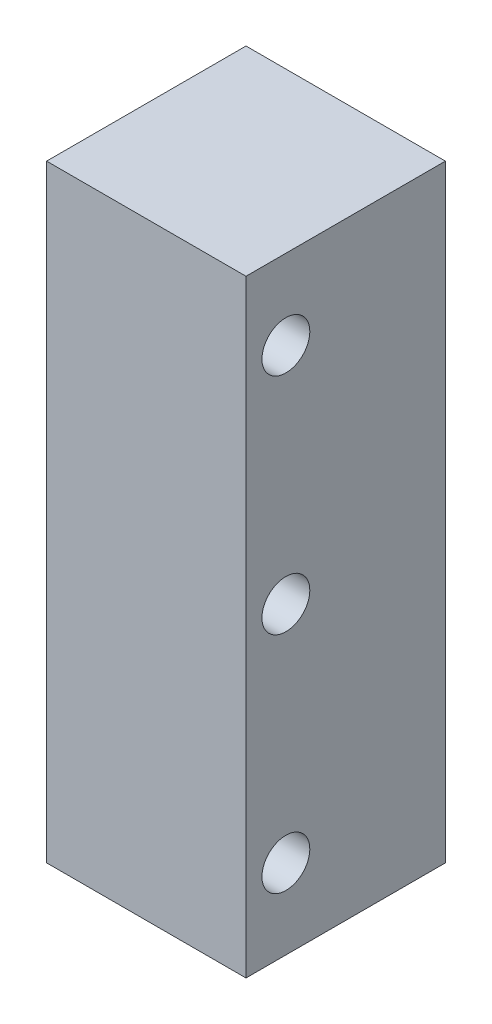
ISO-10303-21;
HEADER;
FILE_DESCRIPTION(('STEP AP214'),'2;1');
FILE_NAME('part.step','',(''),(''),'','','');
FILE_SCHEMA(('AUTOMOTIVE_DESIGN { 1 0 10303 214 1 1 1 1 }'));
ENDSEC;
DATA;
#1=APPLICATION_CONTEXT('core data for automotive mechanical design processes');
#2=APPLICATION_PROTOCOL_DEFINITION('international standard','automotive_design',2000,#1);
#3=PRODUCT_CONTEXT('',#1,'mechanical');
#4=PRODUCT('Part','Part','',(#3));
#5=PRODUCT_RELATED_PRODUCT_CATEGORY('part','',(#4));
#6=PRODUCT_DEFINITION_FORMATION('','',#4);
#7=PRODUCT_DEFINITION_CONTEXT('part definition',#1,'design');
#8=PRODUCT_DEFINITION('design','',#6,#7);
#9=PRODUCT_DEFINITION_SHAPE('','',#8);
#10=(LENGTH_UNIT() NAMED_UNIT(*) SI_UNIT(.MILLI.,.METRE.));
#11=(NAMED_UNIT(*) PLANE_ANGLE_UNIT() SI_UNIT($,.RADIAN.));
#12=(NAMED_UNIT(*) SI_UNIT($,.STERADIAN.) SOLID_ANGLE_UNIT());
#13=UNCERTAINTY_MEASURE_WITH_UNIT(LENGTH_MEASURE(1.E-05),#10,'distance_accuracy_value','');
#14=(GEOMETRIC_REPRESENTATION_CONTEXT(3) GLOBAL_UNCERTAINTY_ASSIGNED_CONTEXT((#13)) GLOBAL_UNIT_ASSIGNED_CONTEXT((#10,
#11,#12)) REPRESENTATION_CONTEXT('',''));
#15=CARTESIAN_POINT('',(0.,0.,0.));
#16=DIRECTION('',(0.,0.,1.));
#17=DIRECTION('',(1.,0.,0.));
#18=AXIS2_PLACEMENT_3D('',#15,#16,#17);
#19=CARTESIAN_POINT('',(25.,76.2,50.));
#20=DIRECTION('',(-1.,0.,0.));
#21=DIRECTION('',(0.,0.,1.));
#22=AXIS2_PLACEMENT_3D('',#19,#20,#21);
#23=PLANE('',#22);
#24=CARTESIAN_POINT('',(25.,56.2,40.));
#25=DIRECTION('',(1.,0.,0.));
#26=DIRECTION('',(0.,1.,0.));
#27=AXIS2_PLACEMENT_3D('',#24,#25,#26);
#28=CIRCLE('',#27,5.99999999999999);
#29=CARTESIAN_POINT('',(25.,62.2,40.));
#30=VERTEX_POINT('',#29);
#31=EDGE_CURVE('E124',#30,#30,#28,.T.);
#32=ORIENTED_EDGE('',*,*,#31,.F.);
#33=EDGE_LOOP('',(#32));
#34=FACE_BOUND('',#33,.T.);
#35=CARTESIAN_POINT('',(25.,0.,40.));
#36=DIRECTION('',(1.,0.,0.));
#37=DIRECTION('',(0.,1.,0.));
#38=AXIS2_PLACEMENT_3D('',#35,#36,#37);
#39=CIRCLE('',#38,5.99999999999999);
#40=CARTESIAN_POINT('',(25.,6.00000000000001,40.));
#41=VERTEX_POINT('',#40);
#42=EDGE_CURVE('E118',#41,#41,#39,.T.);
#43=ORIENTED_EDGE('',*,*,#42,.F.);
#44=EDGE_LOOP('',(#43));
#45=FACE_BOUND('',#44,.T.);
#46=CARTESIAN_POINT('',(25.,-56.2,40.));
#47=DIRECTION('',(1.,0.,0.));
#48=DIRECTION('',(0.,1.,0.));
#49=AXIS2_PLACEMENT_3D('',#46,#47,#48);
#50=CIRCLE('',#49,6.00000000000001);
#51=CARTESIAN_POINT('',(25.,-50.2,40.));
#52=VERTEX_POINT('',#51);
#53=EDGE_CURVE('E112',#52,#52,#50,.T.);
#54=ORIENTED_EDGE('',*,*,#53,.F.);
#55=EDGE_LOOP('',(#54));
#56=FACE_BOUND('',#55,.T.);
#57=DIRECTION('',(0.,1.,0.));
#58=VECTOR('',#57,1.);
#59=CARTESIAN_POINT('',(25.,76.2,0.));
#60=LINE('',#59,#58);
#61=CARTESIAN_POINT('',(25.,-76.2,0.));
#62=VERTEX_POINT('',#61);
#63=CARTESIAN_POINT('',(25.,76.2,0.));
#64=VERTEX_POINT('',#63);
#65=EDGE_CURVE('E98',#62,#64,#60,.T.);
#66=ORIENTED_EDGE('',*,*,#65,.T.);
#67=DIRECTION('',(0.,0.,-1.));
#68=VECTOR('',#67,1.);
#69=CARTESIAN_POINT('',(25.,76.2,50.));
#70=LINE('',#69,#68);
#71=CARTESIAN_POINT('',(25.,76.2,50.));
#72=VERTEX_POINT('',#71);
#73=EDGE_CURVE('E11',#72,#64,#70,.T.);
#74=ORIENTED_EDGE('',*,*,#73,.F.);
#75=DIRECTION('',(0.,1.,0.));
#76=VECTOR('',#75,1.);
#77=CARTESIAN_POINT('',(25.,76.2,50.));
#78=LINE('',#77,#76);
#79=CARTESIAN_POINT('',(25.,-76.2,50.));
#80=VERTEX_POINT('',#79);
#81=EDGE_CURVE('E86',#80,#72,#78,.T.);
#82=ORIENTED_EDGE('',*,*,#81,.F.);
#83=DIRECTION('',(0.,0.,-1.));
#84=VECTOR('',#83,1.);
#85=CARTESIAN_POINT('',(25.,-76.2,50.));
#86=LINE('',#85,#84);
#87=EDGE_CURVE('E94',#80,#62,#86,.T.);
#88=ORIENTED_EDGE('',*,*,#87,.T.);
#89=EDGE_LOOP('',(#66,#74,#82,#88));
#90=FACE_BOUND('',#89,.T.);
#91=ADVANCED_FACE('F35',(#34,#45,#56,#90),#23,.F.);
#92=CARTESIAN_POINT('',(-25.,76.2,50.));
#93=DIRECTION('',(0.,-1.,0.));
#94=DIRECTION('',(0.,0.,-1.));
#95=AXIS2_PLACEMENT_3D('',#92,#93,#94);
#96=PLANE('',#95);
#97=DIRECTION('',(-1.,0.,0.));
#98=VECTOR('',#97,1.);
#99=CARTESIAN_POINT('',(-25.,76.2,0.));
#100=LINE('',#99,#98);
#101=CARTESIAN_POINT('',(-25.,76.2,0.));
#102=VERTEX_POINT('',#101);
#103=EDGE_CURVE('E90',#64,#102,#100,.T.);
#104=ORIENTED_EDGE('',*,*,#103,.T.);
#105=DIRECTION('',(0.,0.,-1.));
#106=VECTOR('',#105,1.);
#107=CARTESIAN_POINT('',(-25.,76.2,50.));
#108=LINE('',#107,#106);
#109=CARTESIAN_POINT('',(-25.,76.2,50.));
#110=VERTEX_POINT('',#109);
#111=EDGE_CURVE('E43',#110,#102,#108,.T.);
#112=ORIENTED_EDGE('',*,*,#111,.F.);
#113=DIRECTION('',(-1.,0.,0.));
#114=VECTOR('',#113,1.);
#115=CARTESIAN_POINT('',(-25.,76.2,50.));
#116=LINE('',#115,#114);
#117=EDGE_CURVE('E81',#72,#110,#116,.T.);
#118=ORIENTED_EDGE('',*,*,#117,.F.);
#119=ORIENTED_EDGE('',*,*,#73,.T.);
#120=EDGE_LOOP('',(#104,#112,#118,#119));
#121=FACE_BOUND('',#120,.T.);
#122=ADVANCED_FACE('F89',(#121),#96,.F.);
#123=CARTESIAN_POINT('',(-25.,76.2,50.));
#124=DIRECTION('',(1.,0.,0.));
#125=DIRECTION('',(0.,1.,0.));
#126=AXIS2_PLACEMENT_3D('',#123,#124,#125);
#127=PLANE('',#126);
#128=CARTESIAN_POINT('',(-25.,56.2,40.));
#129=DIRECTION('',(1.,0.,0.));
#130=DIRECTION('',(0.,1.,0.));
#131=AXIS2_PLACEMENT_3D('',#128,#129,#130);
#132=CIRCLE('',#131,5.99999999999999);
#133=CARTESIAN_POINT('',(-25.,62.2,40.));
#134=VERTEX_POINT('',#133);
#135=EDGE_CURVE('E101',#134,#134,#132,.T.);
#136=ORIENTED_EDGE('',*,*,#135,.T.);
#137=EDGE_LOOP('',(#136));
#138=FACE_BOUND('',#137,.T.);
#139=CARTESIAN_POINT('',(-25.,0.,40.));
#140=DIRECTION('',(1.,0.,0.));
#141=DIRECTION('',(0.,1.,0.));
#142=AXIS2_PLACEMENT_3D('',#139,#140,#141);
#143=CIRCLE('',#142,5.99999999999999);
#144=CARTESIAN_POINT('',(-25.,6.,40.));
#145=VERTEX_POINT('',#144);
#146=EDGE_CURVE('E121',#145,#145,#143,.T.);
#147=ORIENTED_EDGE('',*,*,#146,.T.);
#148=EDGE_LOOP('',(#147));
#149=FACE_BOUND('',#148,.T.);
#150=CARTESIAN_POINT('',(-25.,-56.2,40.));
#151=DIRECTION('',(1.,0.,0.));
#152=DIRECTION('',(0.,1.,0.));
#153=AXIS2_PLACEMENT_3D('',#150,#151,#152);
#154=CIRCLE('',#153,6.00000000000001);
#155=CARTESIAN_POINT('',(-25.,-50.2,40.));
#156=VERTEX_POINT('',#155);
#157=EDGE_CURVE('E115',#156,#156,#154,.T.);
#158=ORIENTED_EDGE('',*,*,#157,.T.);
#159=EDGE_LOOP('',(#158));
#160=FACE_BOUND('',#159,.T.);
#161=DIRECTION('',(0.,-1.,0.));
#162=VECTOR('',#161,1.);
#163=CARTESIAN_POINT('',(-25.,76.2,0.));
#164=LINE('',#163,#162);
#165=CARTESIAN_POINT('',(-25.,-76.2,0.));
#166=VERTEX_POINT('',#165);
#167=EDGE_CURVE('E68',#102,#166,#164,.T.);
#168=ORIENTED_EDGE('',*,*,#167,.T.);
#169=DIRECTION('',(0.,0.,-1.));
#170=VECTOR('',#169,1.);
#171=CARTESIAN_POINT('',(-25.,-76.2,50.));
#172=LINE('',#171,#170);
#173=CARTESIAN_POINT('',(-25.,-76.2,50.));
#174=VERTEX_POINT('',#173);
#175=EDGE_CURVE('E91',#174,#166,#172,.T.);
#176=ORIENTED_EDGE('',*,*,#175,.F.);
#177=DIRECTION('',(0.,-1.,0.));
#178=VECTOR('',#177,1.);
#179=CARTESIAN_POINT('',(-25.,76.2,50.));
#180=LINE('',#179,#178);
#181=EDGE_CURVE('E84',#110,#174,#180,.T.);
#182=ORIENTED_EDGE('',*,*,#181,.F.);
#183=ORIENTED_EDGE('',*,*,#111,.T.);
#184=EDGE_LOOP('',(#168,#176,#182,#183));
#185=FACE_BOUND('',#184,.T.);
#186=ADVANCED_FACE('F92',(#138,#149,#160,#185),#127,.F.);
#187=CARTESIAN_POINT('',(-25.,-76.2,50.));
#188=DIRECTION('',(0.,1.,0.));
#189=DIRECTION('',(0.,0.,1.));
#190=AXIS2_PLACEMENT_3D('',#187,#188,#189);
#191=PLANE('',#190);
#192=DIRECTION('',(1.,0.,0.));
#193=VECTOR('',#192,1.);
#194=CARTESIAN_POINT('',(-25.,-76.2,0.));
#195=LINE('',#194,#193);
#196=EDGE_CURVE('E74',#166,#62,#195,.T.);
#197=ORIENTED_EDGE('',*,*,#196,.T.);
#198=ORIENTED_EDGE('',*,*,#87,.F.);
#199=DIRECTION('',(1.,0.,0.));
#200=VECTOR('',#199,1.);
#201=CARTESIAN_POINT('',(-25.,-76.2,50.));
#202=LINE('',#201,#200);
#203=EDGE_CURVE('E51',#174,#80,#202,.T.);
#204=ORIENTED_EDGE('',*,*,#203,.F.);
#205=ORIENTED_EDGE('',*,*,#175,.T.);
#206=EDGE_LOOP('',(#197,#198,#204,#205));
#207=FACE_BOUND('',#206,.T.);
#208=ADVANCED_FACE('F106',(#207),#191,.F.);
#209=CARTESIAN_POINT('',(0.,0.,50.));
#210=DIRECTION('',(0.,0.,1.));
#211=DIRECTION('',(1.,0.,0.));
#212=AXIS2_PLACEMENT_3D('',#209,#210,#211);
#213=PLANE('',#212);
#214=ORIENTED_EDGE('',*,*,#81,.T.);
#215=ORIENTED_EDGE('',*,*,#117,.T.);
#216=ORIENTED_EDGE('',*,*,#181,.T.);
#217=ORIENTED_EDGE('',*,*,#203,.T.);
#218=EDGE_LOOP('',(#214,#215,#216,#217));
#219=FACE_BOUND('',#218,.T.);
#220=ADVANCED_FACE('F82',(#219),#213,.T.);
#221=CARTESIAN_POINT('',(0.,0.,0.));
#222=DIRECTION('',(0.,0.,1.));
#223=DIRECTION('',(1.,0.,0.));
#224=AXIS2_PLACEMENT_3D('',#221,#222,#223);
#225=PLANE('',#224);
#226=ORIENTED_EDGE('',*,*,#65,.F.);
#227=ORIENTED_EDGE('',*,*,#196,.F.);
#228=ORIENTED_EDGE('',*,*,#167,.F.);
#229=ORIENTED_EDGE('',*,*,#103,.F.);
#230=EDGE_LOOP('',(#226,#227,#228,#229));
#231=FACE_BOUND('',#230,.T.);
#232=ADVANCED_FACE('F109',(#231),#225,.F.);
#233=CARTESIAN_POINT('',(-25.,-56.2,40.));
#234=DIRECTION('',(1.,0.,0.));
#235=DIRECTION('',(0.,1.,0.));
#236=AXIS2_PLACEMENT_3D('',#233,#234,#235);
#237=CYLINDRICAL_SURFACE('',#236,6.00000000000001);
#238=ORIENTED_EDGE('',*,*,#157,.F.);
#239=EDGE_LOOP('',(#238));
#240=FACE_BOUND('',#239,.T.);
#241=ORIENTED_EDGE('',*,*,#53,.T.);
#242=EDGE_LOOP('',(#241));
#243=FACE_BOUND('',#242,.T.);
#244=ADVANCED_FACE('F145',(#240,#243),#237,.F.);
#245=CARTESIAN_POINT('',(-25.,0.,40.));
#246=DIRECTION('',(1.,0.,0.));
#247=DIRECTION('',(0.,1.,0.));
#248=AXIS2_PLACEMENT_3D('',#245,#246,#247);
#249=CYLINDRICAL_SURFACE('',#248,5.99999999999999);
#250=ORIENTED_EDGE('',*,*,#146,.F.);
#251=EDGE_LOOP('',(#250));
#252=FACE_BOUND('',#251,.T.);
#253=ORIENTED_EDGE('',*,*,#42,.T.);
#254=EDGE_LOOP('',(#253));
#255=FACE_BOUND('',#254,.T.);
#256=ADVANCED_FACE('F135',(#252,#255),#249,.F.);
#257=CARTESIAN_POINT('',(-25.,56.2,40.));
#258=DIRECTION('',(1.,0.,0.));
#259=DIRECTION('',(0.,1.,0.));
#260=AXIS2_PLACEMENT_3D('',#257,#258,#259);
#261=CYLINDRICAL_SURFACE('',#260,5.99999999999999);
#262=ORIENTED_EDGE('',*,*,#135,.F.);
#263=EDGE_LOOP('',(#262));
#264=FACE_BOUND('',#263,.T.);
#265=ORIENTED_EDGE('',*,*,#31,.T.);
#266=EDGE_LOOP('',(#265));
#267=FACE_BOUND('',#266,.T.);
#268=ADVANCED_FACE('F132',(#264,#267),#261,.F.);
#269=CLOSED_SHELL('',(#91,#122,#186,#208,#220,#232,#244,#256,#268));
#270=MANIFOLD_SOLID_BREP('B2',#269);
#271=ADVANCED_BREP_SHAPE_REPRESENTATION('',(#18,#270),#14);
#272=SHAPE_DEFINITION_REPRESENTATION(#9,#271);
ENDSEC;
END-ISO-10303-21;
